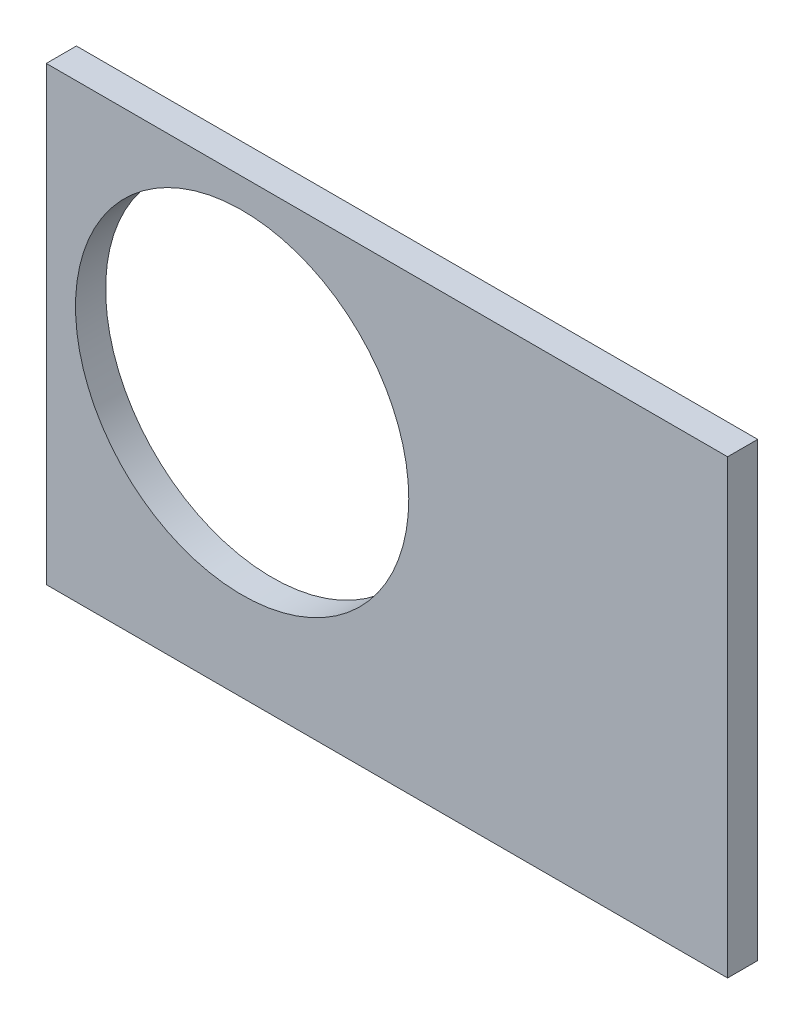
ISO-10303-21;
HEADER;
FILE_DESCRIPTION(('STEP AP214'),'2;1');
FILE_NAME('part.step','',(''),(''),'','','');
FILE_SCHEMA(('AUTOMOTIVE_DESIGN { 1 0 10303 214 1 1 1 1 }'));
ENDSEC;
DATA;
#1=APPLICATION_CONTEXT('core data for automotive mechanical design processes');
#2=APPLICATION_PROTOCOL_DEFINITION('international standard','automotive_design',2000,#1);
#3=PRODUCT_CONTEXT('',#1,'mechanical');
#4=PRODUCT('Part','Part','',(#3));
#5=PRODUCT_RELATED_PRODUCT_CATEGORY('part','',(#4));
#6=PRODUCT_DEFINITION_FORMATION('','',#4);
#7=PRODUCT_DEFINITION_CONTEXT('part definition',#1,'design');
#8=PRODUCT_DEFINITION('design','',#6,#7);
#9=PRODUCT_DEFINITION_SHAPE('','',#8);
#10=(LENGTH_UNIT() NAMED_UNIT(*) SI_UNIT(.MILLI.,.METRE.));
#11=(NAMED_UNIT(*) PLANE_ANGLE_UNIT() SI_UNIT($,.RADIAN.));
#12=(NAMED_UNIT(*) SI_UNIT($,.STERADIAN.) SOLID_ANGLE_UNIT());
#13=UNCERTAINTY_MEASURE_WITH_UNIT(LENGTH_MEASURE(1.E-05),#10,'distance_accuracy_value','');
#14=(GEOMETRIC_REPRESENTATION_CONTEXT(3) GLOBAL_UNCERTAINTY_ASSIGNED_CONTEXT((#13)) GLOBAL_UNIT_ASSIGNED_CONTEXT((#10,
#11,#12)) REPRESENTATION_CONTEXT('',''));
#15=CARTESIAN_POINT('',(0.,0.,0.));
#16=DIRECTION('',(0.,0.,1.));
#17=DIRECTION('',(1.,0.,0.));
#18=AXIS2_PLACEMENT_3D('',#15,#16,#17);
#19=CARTESIAN_POINT('',(-41.275,41.275,-6.35));
#20=DIRECTION('',(-1.,0.,0.));
#21=DIRECTION('',(0.,-1.,0.));
#22=AXIS2_PLACEMENT_3D('',#19,#20,#21);
#23=PLANE('',#22);
#24=DIRECTION('',(0.,-1.,0.));
#25=VECTOR('',#24,1.);
#26=CARTESIAN_POINT('',(-41.275,41.275,0.));
#27=LINE('',#26,#25);
#28=CARTESIAN_POINT('',(-41.275,41.275,0.));
#29=VERTEX_POINT('',#28);
#30=CARTESIAN_POINT('',(-41.275,-53.848,0.));
#31=VERTEX_POINT('',#30);
#32=EDGE_CURVE('E98',#29,#31,#27,.T.);
#33=ORIENTED_EDGE('',*,*,#32,.F.);
#34=DIRECTION('',(0.,0.,1.));
#35=VECTOR('',#34,1.);
#36=CARTESIAN_POINT('',(-41.275,41.275,-6.35));
#37=LINE('',#36,#35);
#38=CARTESIAN_POINT('',(-41.275,41.275,-6.35));
#39=VERTEX_POINT('',#38);
#40=EDGE_CURVE('E11',#39,#29,#37,.T.);
#41=ORIENTED_EDGE('',*,*,#40,.F.);
#42=DIRECTION('',(0.,-1.,0.));
#43=VECTOR('',#42,1.);
#44=CARTESIAN_POINT('',(-41.275,41.275,-6.35));
#45=LINE('',#44,#43);
#46=CARTESIAN_POINT('',(-41.275,-53.848,-6.35));
#47=VERTEX_POINT('',#46);
#48=EDGE_CURVE('E91',#39,#47,#45,.T.);
#49=ORIENTED_EDGE('',*,*,#48,.T.);
#50=DIRECTION('',(0.,0.,1.));
#51=VECTOR('',#50,1.);
#52=CARTESIAN_POINT('',(-41.275,-53.848,-6.35));
#53=LINE('',#52,#51);
#54=EDGE_CURVE('E36',#47,#31,#53,.T.);
#55=ORIENTED_EDGE('',*,*,#54,.T.);
#56=EDGE_LOOP('',(#33,#41,#49,#55));
#57=FACE_BOUND('',#56,.T.);
#58=ADVANCED_FACE('F33',(#57),#23,.T.);
#59=CARTESIAN_POINT('',(-41.275,41.275,-6.35));
#60=DIRECTION('',(0.,1.,0.));
#61=DIRECTION('',(0.,0.,1.));
#62=AXIS2_PLACEMENT_3D('',#59,#60,#61);
#63=PLANE('',#62);
#64=DIRECTION('',(-1.,0.,0.));
#65=VECTOR('',#64,1.);
#66=CARTESIAN_POINT('',(-41.275,41.275,0.));
#67=LINE('',#66,#65);
#68=CARTESIAN_POINT('',(102.2985,41.275,0.));
#69=VERTEX_POINT('',#68);
#70=EDGE_CURVE('E93',#69,#29,#67,.T.);
#71=ORIENTED_EDGE('',*,*,#70,.F.);
#72=DIRECTION('',(0.,0.,1.));
#73=VECTOR('',#72,1.);
#74=CARTESIAN_POINT('',(102.2985,41.275,-6.35));
#75=LINE('',#74,#73);
#76=CARTESIAN_POINT('',(102.2985,41.275,-6.35));
#77=VERTEX_POINT('',#76);
#78=EDGE_CURVE('E42',#77,#69,#75,.T.);
#79=ORIENTED_EDGE('',*,*,#78,.F.);
#80=DIRECTION('',(-1.,0.,0.));
#81=VECTOR('',#80,1.);
#82=CARTESIAN_POINT('',(-41.275,41.275,-6.35));
#83=LINE('',#82,#81);
#84=EDGE_CURVE('E88',#77,#39,#83,.T.);
#85=ORIENTED_EDGE('',*,*,#84,.T.);
#86=ORIENTED_EDGE('',*,*,#40,.T.);
#87=EDGE_LOOP('',(#71,#79,#85,#86));
#88=FACE_BOUND('',#87,.T.);
#89=ADVANCED_FACE('F109',(#88),#63,.T.);
#90=CARTESIAN_POINT('',(102.2985,41.275,-6.35));
#91=DIRECTION('',(1.,0.,0.));
#92=DIRECTION('',(0.,1.,0.));
#93=AXIS2_PLACEMENT_3D('',#90,#91,#92);
#94=PLANE('',#93);
#95=DIRECTION('',(0.,1.,0.));
#96=VECTOR('',#95,1.);
#97=CARTESIAN_POINT('',(102.2985,41.275,0.));
#98=LINE('',#97,#96);
#99=CARTESIAN_POINT('',(102.2985,-53.848,0.));
#100=VERTEX_POINT('',#99);
#101=EDGE_CURVE('E83',#100,#69,#98,.T.);
#102=ORIENTED_EDGE('',*,*,#101,.F.);
#103=DIRECTION('',(0.,0.,1.));
#104=VECTOR('',#103,1.);
#105=CARTESIAN_POINT('',(102.2985,-53.848,-6.35));
#106=LINE('',#105,#104);
#107=CARTESIAN_POINT('',(102.2985,-53.848,-6.35));
#108=VERTEX_POINT('',#107);
#109=EDGE_CURVE('E78',#108,#100,#106,.T.);
#110=ORIENTED_EDGE('',*,*,#109,.F.);
#111=DIRECTION('',(0.,1.,0.));
#112=VECTOR('',#111,1.);
#113=CARTESIAN_POINT('',(102.2985,41.275,-6.35));
#114=LINE('',#113,#112);
#115=EDGE_CURVE('E81',#108,#77,#114,.T.);
#116=ORIENTED_EDGE('',*,*,#115,.T.);
#117=ORIENTED_EDGE('',*,*,#78,.T.);
#118=EDGE_LOOP('',(#102,#110,#116,#117));
#119=FACE_BOUND('',#118,.T.);
#120=ADVANCED_FACE('F80',(#119),#94,.T.);
#121=CARTESIAN_POINT('',(-41.275,-53.848,-6.35));
#122=DIRECTION('',(0.,-1.,0.));
#123=DIRECTION('',(0.,0.,-1.));
#124=AXIS2_PLACEMENT_3D('',#121,#122,#123);
#125=PLANE('',#124);
#126=DIRECTION('',(1.,0.,0.));
#127=VECTOR('',#126,1.);
#128=CARTESIAN_POINT('',(-41.275,-53.848,0.));
#129=LINE('',#128,#127);
#130=EDGE_CURVE('E101',#31,#100,#129,.T.);
#131=ORIENTED_EDGE('',*,*,#130,.F.);
#132=ORIENTED_EDGE('',*,*,#54,.F.);
#133=DIRECTION('',(1.,0.,0.));
#134=VECTOR('',#133,1.);
#135=CARTESIAN_POINT('',(-41.275,-53.848,-6.35));
#136=LINE('',#135,#134);
#137=EDGE_CURVE('E87',#47,#108,#136,.T.);
#138=ORIENTED_EDGE('',*,*,#137,.T.);
#139=ORIENTED_EDGE('',*,*,#109,.T.);
#140=EDGE_LOOP('',(#131,#132,#138,#139));
#141=FACE_BOUND('',#140,.T.);
#142=ADVANCED_FACE('F90',(#141),#125,.T.);
#143=CARTESIAN_POINT('',(0.,0.,-6.35));
#144=DIRECTION('',(0.,0.,1.));
#145=DIRECTION('',(1.,0.,0.));
#146=AXIS2_PLACEMENT_3D('',#143,#144,#145);
#147=PLANE('',#146);
#148=CARTESIAN_POINT('',(0.,0.,-6.35));
#149=DIRECTION('',(0.,0.,1.));
#150=DIRECTION('',(1.,0.,0.));
#151=AXIS2_PLACEMENT_3D('',#148,#149,#150);
#152=CIRCLE('',#151,35.1155);
#153=CARTESIAN_POINT('',(35.1155,0.,-6.35));
#154=VERTEX_POINT('',#153);
#155=EDGE_CURVE('E102',#154,#154,#152,.T.);
#156=ORIENTED_EDGE('',*,*,#155,.T.);
#157=EDGE_LOOP('',(#156));
#158=FACE_BOUND('',#157,.T.);
#159=ORIENTED_EDGE('',*,*,#48,.F.);
#160=ORIENTED_EDGE('',*,*,#84,.F.);
#161=ORIENTED_EDGE('',*,*,#115,.F.);
#162=ORIENTED_EDGE('',*,*,#137,.F.);
#163=EDGE_LOOP('',(#159,#160,#161,#162));
#164=FACE_BOUND('',#163,.T.);
#165=ADVANCED_FACE('F86',(#158,#164),#147,.F.);
#166=CARTESIAN_POINT('',(0.,0.,0.));
#167=DIRECTION('',(0.,0.,1.));
#168=DIRECTION('',(1.,0.,0.));
#169=AXIS2_PLACEMENT_3D('',#166,#167,#168);
#170=PLANE('',#169);
#171=CARTESIAN_POINT('',(0.,0.,0.));
#172=DIRECTION('',(0.,0.,1.));
#173=DIRECTION('',(1.,0.,0.));
#174=AXIS2_PLACEMENT_3D('',#171,#172,#173);
#175=CIRCLE('',#174,35.1155);
#176=CARTESIAN_POINT('',(35.1155,0.,0.));
#177=VERTEX_POINT('',#176);
#178=EDGE_CURVE('E139',#177,#177,#175,.T.);
#179=ORIENTED_EDGE('',*,*,#178,.F.);
#180=EDGE_LOOP('',(#179));
#181=FACE_BOUND('',#180,.T.);
#182=ORIENTED_EDGE('',*,*,#32,.T.);
#183=ORIENTED_EDGE('',*,*,#130,.T.);
#184=ORIENTED_EDGE('',*,*,#101,.T.);
#185=ORIENTED_EDGE('',*,*,#70,.T.);
#186=EDGE_LOOP('',(#182,#183,#184,#185));
#187=FACE_BOUND('',#186,.T.);
#188=ADVANCED_FACE('F108',(#181,#187),#170,.T.);
#189=CARTESIAN_POINT('',(0.,0.,-6.35));
#190=DIRECTION('',(0.,0.,1.));
#191=DIRECTION('',(1.,0.,0.));
#192=AXIS2_PLACEMENT_3D('',#189,#190,#191);
#193=CYLINDRICAL_SURFACE('',#192,35.1155);
#194=ORIENTED_EDGE('',*,*,#155,.F.);
#195=EDGE_LOOP('',(#194));
#196=FACE_BOUND('',#195,.T.);
#197=ORIENTED_EDGE('',*,*,#178,.T.);
#198=EDGE_LOOP('',(#197));
#199=FACE_BOUND('',#198,.T.);
#200=ADVANCED_FACE('F127',(#196,#199),#193,.F.);
#201=CLOSED_SHELL('',(#58,#89,#120,#142,#165,#188,#200));
#202=MANIFOLD_SOLID_BREP('B2',#201);
#203=ADVANCED_BREP_SHAPE_REPRESENTATION('',(#18,#202),#14);
#204=SHAPE_DEFINITION_REPRESENTATION(#9,#203);
ENDSEC;
END-ISO-10303-21;
